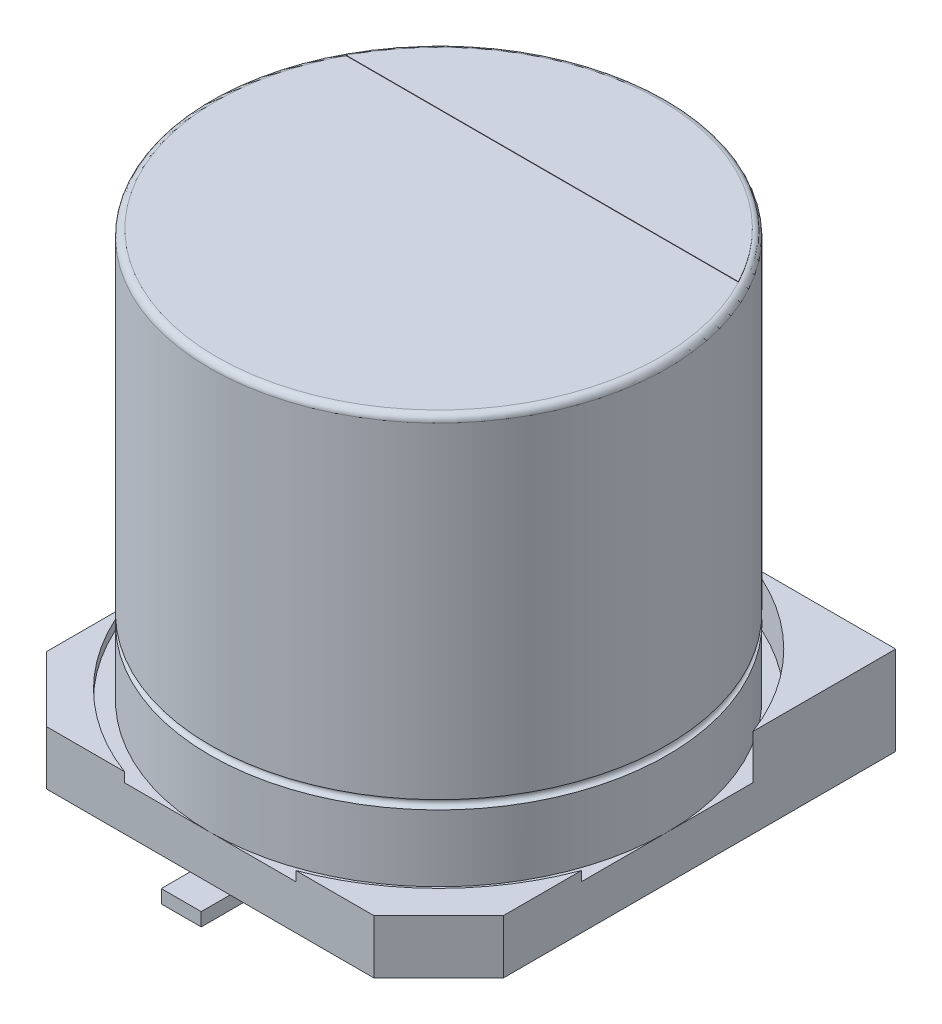
ISO-10303-21;
HEADER;
FILE_DESCRIPTION(('STEP AP214'),'2;1');
FILE_NAME('part.step','',(''),(''),'','','');
FILE_SCHEMA(('AUTOMOTIVE_DESIGN { 1 0 10303 214 1 1 1 1 }'));
ENDSEC;
DATA;
#1=APPLICATION_CONTEXT('core data for automotive mechanical design processes');
#2=APPLICATION_PROTOCOL_DEFINITION('international standard','automotive_design',2000,#1);
#3=PRODUCT_CONTEXT('',#1,'mechanical');
#4=PRODUCT('Part','Part','',(#3));
#5=PRODUCT_RELATED_PRODUCT_CATEGORY('part','',(#4));
#6=PRODUCT_DEFINITION_FORMATION('','',#4);
#7=PRODUCT_DEFINITION_CONTEXT('part definition',#1,'design');
#8=PRODUCT_DEFINITION('design','',#6,#7);
#9=PRODUCT_DEFINITION_SHAPE('','',#8);
#10=(LENGTH_UNIT() NAMED_UNIT(*) SI_UNIT(.MILLI.,.METRE.));
#11=(NAMED_UNIT(*) PLANE_ANGLE_UNIT() SI_UNIT($,.RADIAN.));
#12=(NAMED_UNIT(*) SI_UNIT($,.STERADIAN.) SOLID_ANGLE_UNIT());
#13=UNCERTAINTY_MEASURE_WITH_UNIT(LENGTH_MEASURE(1.E-05),#10,'distance_accuracy_value','');
#14=(GEOMETRIC_REPRESENTATION_CONTEXT(3) GLOBAL_UNCERTAINTY_ASSIGNED_CONTEXT((#13)) GLOBAL_UNIT_ASSIGNED_CONTEXT((#10,
#11,#12)) REPRESENTATION_CONTEXT('',''));
#15=CARTESIAN_POINT('',(0.,0.,0.));
#16=DIRECTION('',(0.,0.,1.));
#17=DIRECTION('',(1.,0.,0.));
#18=AXIS2_PLACEMENT_3D('',#15,#16,#17);
#19=CARTESIAN_POINT('',(0.,0.,0.));
#20=DIRECTION('',(0.,-1.,0.));
#21=DIRECTION('',(0.,0.,-1.));
#22=AXIS2_PLACEMENT_3D('',#19,#20,#21);
#23=PLANE('',#22);
#24=DIRECTION('',(-1.,0.,0.));
#25=VECTOR('',#24,1.);
#26=CARTESIAN_POINT('',(0.45,0.,-2.3));
#27=LINE('',#26,#25);
#28=CARTESIAN_POINT('',(0.45,0.,-2.3));
#29=VERTEX_POINT('',#28);
#30=CARTESIAN_POINT('',(-0.45,0.,-2.3));
#31=VERTEX_POINT('',#30);
#32=EDGE_CURVE('E760',#29,#31,#27,.T.);
#33=ORIENTED_EDGE('',*,*,#32,.F.);
#34=DIRECTION('',(0.,0.,-1.));
#35=VECTOR('',#34,1.);
#36=CARTESIAN_POINT('',(0.45,0.,0.));
#37=LINE('',#36,#35);
#38=CARTESIAN_POINT('',(0.450000000000001,0.,-5.15));
#39=VERTEX_POINT('',#38);
#40=EDGE_CURVE('E11',#29,#39,#37,.T.);
#41=ORIENTED_EDGE('',*,*,#40,.T.);
#42=DIRECTION('',(-1.,0.,0.));
#43=VECTOR('',#42,1.);
#44=CARTESIAN_POINT('',(-5.15,0.,-5.15));
#45=LINE('',#44,#43);
#46=CARTESIAN_POINT('',(5.15,0.,-5.15));
#47=VERTEX_POINT('',#46);
#48=EDGE_CURVE('E422',#47,#39,#45,.T.);
#49=ORIENTED_EDGE('',*,*,#48,.F.);
#50=DIRECTION('',(0.,0.,-1.));
#51=VECTOR('',#50,1.);
#52=CARTESIAN_POINT('',(5.15,0.,-5.15));
#53=LINE('',#52,#51);
#54=CARTESIAN_POINT('',(5.15,0.,3.69119369495388));
#55=VERTEX_POINT('',#54);
#56=EDGE_CURVE('E448',#55,#47,#53,.T.);
#57=ORIENTED_EDGE('',*,*,#56,.F.);
#58=DIRECTION('',(0.707106781186548,0.,-0.707106781186547));
#59=VECTOR('',#58,1.);
#60=CARTESIAN_POINT('',(5.15,0.,3.69119369495388));
#61=LINE('',#60,#59);
#62=CARTESIAN_POINT('',(3.69119369495388,0.,5.15));
#63=VERTEX_POINT('',#62);
#64=EDGE_CURVE('E443',#63,#55,#61,.T.);
#65=ORIENTED_EDGE('',*,*,#64,.F.);
#66=DIRECTION('',(1.,0.,0.));
#67=VECTOR('',#66,1.);
#68=CARTESIAN_POINT('',(3.69119369495388,0.,5.15));
#69=LINE('',#68,#67);
#70=CARTESIAN_POINT('',(0.450000000000001,0.,5.15));
#71=VERTEX_POINT('',#70);
#72=EDGE_CURVE('E438',#71,#63,#69,.T.);
#73=ORIENTED_EDGE('',*,*,#72,.F.);
#74=DIRECTION('',(0.,0.,1.));
#75=VECTOR('',#74,1.);
#76=CARTESIAN_POINT('',(0.45,0.,2.3));
#77=LINE('',#76,#75);
#78=CARTESIAN_POINT('',(0.45,0.,2.3));
#79=VERTEX_POINT('',#78);
#80=EDGE_CURVE('E280',#79,#71,#77,.T.);
#81=ORIENTED_EDGE('',*,*,#80,.F.);
#82=DIRECTION('',(1.,0.,0.));
#83=VECTOR('',#82,1.);
#84=CARTESIAN_POINT('',(0.45,0.,2.3));
#85=LINE('',#84,#83);
#86=CARTESIAN_POINT('',(-0.45,0.,2.3));
#87=VERTEX_POINT('',#86);
#88=EDGE_CURVE('E65',#87,#79,#85,.T.);
#89=ORIENTED_EDGE('',*,*,#88,.F.);
#90=DIRECTION('',(0.,0.,-1.));
#91=VECTOR('',#90,1.);
#92=CARTESIAN_POINT('',(-0.45,0.,2.3));
#93=LINE('',#92,#91);
#94=CARTESIAN_POINT('',(-0.449999999999998,0.,5.15));
#95=VERTEX_POINT('',#94);
#96=EDGE_CURVE('E50',#95,#87,#93,.T.);
#97=ORIENTED_EDGE('',*,*,#96,.F.);
#98=CARTESIAN_POINT('',(-3.69119369495388,0.,5.15));
#99=VERTEX_POINT('',#98);
#100=EDGE_CURVE('E439',#99,#95,#69,.T.);
#101=ORIENTED_EDGE('',*,*,#100,.F.);
#102=DIRECTION('',(0.707106781186548,0.,0.707106781186547));
#103=VECTOR('',#102,1.);
#104=CARTESIAN_POINT('',(-3.69119369495388,0.,5.15));
#105=LINE('',#104,#103);
#106=CARTESIAN_POINT('',(-5.15,0.,3.69119369495388));
#107=VERTEX_POINT('',#106);
#108=EDGE_CURVE('E434',#107,#99,#105,.T.);
#109=ORIENTED_EDGE('',*,*,#108,.F.);
#110=DIRECTION('',(0.,0.,1.));
#111=VECTOR('',#110,1.);
#112=CARTESIAN_POINT('',(-5.15,0.,3.69119369495388));
#113=LINE('',#112,#111);
#114=CARTESIAN_POINT('',(-5.15,0.,-5.15));
#115=VERTEX_POINT('',#114);
#116=EDGE_CURVE('E416',#115,#107,#113,.T.);
#117=ORIENTED_EDGE('',*,*,#116,.F.);
#118=CARTESIAN_POINT('',(-0.449999999999999,0.,-5.15));
#119=VERTEX_POINT('',#118);
#120=EDGE_CURVE('E451',#119,#115,#45,.T.);
#121=ORIENTED_EDGE('',*,*,#120,.F.);
#122=DIRECTION('',(0.,0.,-1.));
#123=VECTOR('',#122,1.);
#124=CARTESIAN_POINT('',(-0.45,0.,-2.3));
#125=LINE('',#124,#123);
#126=EDGE_CURVE('E754',#31,#119,#125,.T.);
#127=ORIENTED_EDGE('',*,*,#126,.F.);
#128=EDGE_LOOP('',(#33,#41,#49,#57,#65,#73,#81,#89,#97,#101,#109,#117,#121,#127));
#129=FACE_BOUND('',#128,.T.);
#130=ADVANCED_FACE('F41',(#129),#23,.T.);
#131=CARTESIAN_POINT('',(-5.,10.2,0.));
#132=DIRECTION('',(0.,1.,0.));
#133=DIRECTION('',(0.,0.,1.));
#134=AXIS2_PLACEMENT_3D('',#131,#132,#133);
#135=PLANE('',#134);
#136=CARTESIAN_POINT('',(0.,10.2,0.));
#137=DIRECTION('',(0.,1.,0.));
#138=DIRECTION('',(0.,0.,1.));
#139=AXIS2_PLACEMENT_3D('',#136,#137,#138);
#140=CIRCLE('',#139,5.);
#141=CARTESIAN_POINT('',(-4.42028767087711,10.2,-2.33689043532038));
#142=VERTEX_POINT('',#141);
#143=CARTESIAN_POINT('',(4.42028767087711,10.2,-2.33689043532038));
#144=VERTEX_POINT('',#143);
#145=EDGE_CURVE('E336',#142,#144,#140,.T.);
#146=ORIENTED_EDGE('',*,*,#145,.T.);
#147=DIRECTION('',(1.,0.,0.));
#148=VECTOR('',#147,1.);
#149=CARTESIAN_POINT('',(-4.42028767087711,10.2,-2.33689043532038));
#150=LINE('',#149,#148);
#151=EDGE_CURVE('E301',#142,#144,#150,.T.);
#152=ORIENTED_EDGE('',*,*,#151,.F.);
#153=EDGE_LOOP('',(#146,#152));
#154=FACE_BOUND('',#153,.T.);
#155=ADVANCED_FACE('F620',(#154),#135,.T.);
#156=CARTESIAN_POINT('',(0.,1.,0.));
#157=DIRECTION('',(0.,1.,0.));
#158=DIRECTION('',(0.,0.,1.));
#159=AXIS2_PLACEMENT_3D('',#156,#157,#158);
#160=PLANE('',#159);
#161=CARTESIAN_POINT('',(0.,1.,0.));
#162=DIRECTION('',(0.,1.,0.));
#163=DIRECTION('',(0.,0.,1.));
#164=AXIS2_PLACEMENT_3D('',#161,#162,#163);
#165=CIRCLE('',#164,5.15);
#166=CARTESIAN_POINT('',(0.,1.,5.15));
#167=VERTEX_POINT('',#166);
#168=CARTESIAN_POINT('',(5.15,1.,0.));
#169=VERTEX_POINT('',#168);
#170=EDGE_CURVE('E320',#167,#169,#165,.T.);
#171=ORIENTED_EDGE('',*,*,#170,.F.);
#172=DIRECTION('',(1.,0.,0.));
#173=VECTOR('',#172,1.);
#174=CARTESIAN_POINT('',(3.69119369495388,1.,5.15));
#175=LINE('',#174,#173);
#176=CARTESIAN_POINT('',(1.93067345763078,1.,5.15));
#177=VERTEX_POINT('',#176);
#178=EDGE_CURVE('E407',#167,#177,#175,.T.);
#179=ORIENTED_EDGE('',*,*,#178,.T.);
#180=CARTESIAN_POINT('',(0.,1.,0.));
#181=DIRECTION('',(0.,1.,0.));
#182=DIRECTION('',(0.,0.,1.));
#183=AXIS2_PLACEMENT_3D('',#180,#181,#182);
#184=CIRCLE('',#183,5.5);
#185=CARTESIAN_POINT('',(5.15,1.,1.93067345763078));
#186=VERTEX_POINT('',#185);
#187=EDGE_CURVE('E365',#177,#186,#184,.T.);
#188=ORIENTED_EDGE('',*,*,#187,.T.);
#189=DIRECTION('',(0.,0.,-1.));
#190=VECTOR('',#189,1.);
#191=CARTESIAN_POINT('',(5.15,1.,-5.15));
#192=LINE('',#191,#190);
#193=EDGE_CURVE('E403',#186,#169,#192,.T.);
#194=ORIENTED_EDGE('',*,*,#193,.T.);
#195=EDGE_LOOP('',(#171,#179,#188,#194));
#196=FACE_BOUND('',#195,.T.);
#197=ADVANCED_FACE('F575',(#196),#160,.T.);
#198=CARTESIAN_POINT('',(0.,1.,0.));
#199=DIRECTION('',(0.,1.,0.));
#200=DIRECTION('',(0.,0.,1.));
#201=AXIS2_PLACEMENT_3D('',#198,#199,#200);
#202=CIRCLE('',#201,5.15);
#203=CARTESIAN_POINT('',(0.,1.,-5.15));
#204=VERTEX_POINT('',#203);
#205=EDGE_CURVE('E493',#169,#204,#202,.T.);
#206=ORIENTED_EDGE('',*,*,#205,.F.);
#207=CARTESIAN_POINT('',(5.15,1.,-1.93067345763078));
#208=VERTEX_POINT('',#207);
#209=EDGE_CURVE('E402',#169,#208,#192,.T.);
#210=ORIENTED_EDGE('',*,*,#209,.T.);
#211=CARTESIAN_POINT('',(1.93067345763078,1.,-5.15));
#212=VERTEX_POINT('',#211);
#213=EDGE_CURVE('E370',#208,#212,#184,.T.);
#214=ORIENTED_EDGE('',*,*,#213,.T.);
#215=DIRECTION('',(-1.,0.,0.));
#216=VECTOR('',#215,1.);
#217=CARTESIAN_POINT('',(-5.15,1.,-5.15));
#218=LINE('',#217,#216);
#219=EDGE_CURVE('E481',#212,#204,#218,.T.);
#220=ORIENTED_EDGE('',*,*,#219,.T.);
#221=EDGE_LOOP('',(#206,#210,#214,#220));
#222=FACE_BOUND('',#221,.T.);
#223=ADVANCED_FACE('F792',(#222),#160,.T.);
#224=CARTESIAN_POINT('',(-5.15,1.,0.));
#225=VERTEX_POINT('',#224);
#226=EDGE_CURVE('E492',#204,#225,#202,.T.);
#227=ORIENTED_EDGE('',*,*,#226,.F.);
#228=CARTESIAN_POINT('',(-1.93067345763078,1.,-5.15));
#229=VERTEX_POINT('',#228);
#230=EDGE_CURVE('E486',#204,#229,#218,.T.);
#231=ORIENTED_EDGE('',*,*,#230,.T.);
#232=CARTESIAN_POINT('',(-5.15,1.,-1.93067345763078));
#233=VERTEX_POINT('',#232);
#234=EDGE_CURVE('E553',#229,#233,#184,.T.);
#235=ORIENTED_EDGE('',*,*,#234,.T.);
#236=DIRECTION('',(0.,0.,1.));
#237=VECTOR('',#236,1.);
#238=CARTESIAN_POINT('',(-5.15,1.,3.69119369495388));
#239=LINE('',#238,#237);
#240=EDGE_CURVE('E412',#233,#225,#239,.T.);
#241=ORIENTED_EDGE('',*,*,#240,.T.);
#242=EDGE_LOOP('',(#227,#231,#235,#241));
#243=FACE_BOUND('',#242,.T.);
#244=ADVANCED_FACE('F783',(#243),#160,.T.);
#245=CARTESIAN_POINT('',(0.,2.,0.));
#246=DIRECTION('',(0.,-1.,0.));
#247=DIRECTION('',(0.,0.,-1.));
#248=AXIS2_PLACEMENT_3D('',#245,#246,#247);
#249=PLANE('',#248);
#250=DIRECTION('',(-1.,0.,0.));
#251=VECTOR('',#250,1.);
#252=CARTESIAN_POINT('',(-5.15,2.,-5.15));
#253=LINE('',#252,#251);
#254=CARTESIAN_POINT('',(5.15,2.,-5.15));
#255=VERTEX_POINT('',#254);
#256=CARTESIAN_POINT('',(1.93067345763078,2.,-5.15));
#257=VERTEX_POINT('',#256);
#258=EDGE_CURVE('E426',#255,#257,#253,.T.);
#259=ORIENTED_EDGE('',*,*,#258,.T.);
#260=CARTESIAN_POINT('',(0.,2.,0.));
#261=DIRECTION('',(0.,-1.,0.));
#262=DIRECTION('',(0.,0.,-1.));
#263=AXIS2_PLACEMENT_3D('',#260,#261,#262);
#264=CIRCLE('',#263,5.5);
#265=CARTESIAN_POINT('',(5.15,2.,-1.93067345763078));
#266=VERTEX_POINT('',#265);
#267=EDGE_CURVE('E480',#257,#266,#264,.T.);
#268=ORIENTED_EDGE('',*,*,#267,.T.);
#269=DIRECTION('',(0.,0.,-1.));
#270=VECTOR('',#269,1.);
#271=CARTESIAN_POINT('',(5.15,2.,-5.15));
#272=LINE('',#271,#270);
#273=EDGE_CURVE('E421',#266,#255,#272,.T.);
#274=ORIENTED_EDGE('',*,*,#273,.T.);
#275=EDGE_LOOP('',(#259,#268,#274));
#276=FACE_BOUND('',#275,.T.);
#277=ADVANCED_FACE('F544',(#276),#249,.F.);
#278=CARTESIAN_POINT('',(-5.15,2.,3.69119369495388));
#279=DIRECTION('',(1.,0.,0.));
#280=DIRECTION('',(0.,0.,-1.));
#281=AXIS2_PLACEMENT_3D('',#278,#279,#280);
#282=PLANE('',#281);
#283=DIRECTION('',(0.,-1.,0.));
#284=VECTOR('',#283,1.);
#285=CARTESIAN_POINT('',(-5.15,2.,3.69119369495388));
#286=LINE('',#285,#284);
#287=CARTESIAN_POINT('',(-5.15,1.21736242578591,3.69119369495388));
#288=VERTEX_POINT('',#287);
#289=EDGE_CURVE('E473',#288,#107,#286,.T.);
#290=ORIENTED_EDGE('',*,*,#289,.F.);
#291=DIRECTION('',(0.,0.,1.));
#292=VECTOR('',#291,1.);
#293=CARTESIAN_POINT('',(-5.15,1.21736242578591,0.916515138991169));
#294=LINE('',#293,#292);
#295=CARTESIAN_POINT('',(-5.15,1.21736242578591,1.93067345763078));
#296=VERTEX_POINT('',#295);
#297=EDGE_CURVE('E341',#296,#288,#294,.T.);
#298=ORIENTED_EDGE('',*,*,#297,.F.);
#299=DIRECTION('',(0.,1.,0.));
#300=VECTOR('',#299,1.);
#301=CARTESIAN_POINT('',(-5.15,1.,1.93067345763078));
#302=LINE('',#301,#300);
#303=CARTESIAN_POINT('',(-5.15,1.,1.93067345763078));
#304=VERTEX_POINT('',#303);
#305=EDGE_CURVE('E394',#296,#304,#302,.F.);
#306=ORIENTED_EDGE('',*,*,#305,.T.);
#307=EDGE_CURVE('E411',#225,#304,#239,.T.);
#308=ORIENTED_EDGE('',*,*,#307,.F.);
#309=ORIENTED_EDGE('',*,*,#240,.F.);
#310=DIRECTION('',(0.,1.,0.));
#311=VECTOR('',#310,1.);
#312=CARTESIAN_POINT('',(-5.15,1.,-1.93067345763078));
#313=LINE('',#312,#311);
#314=CARTESIAN_POINT('',(-5.15,2.,-1.93067345763078));
#315=VERTEX_POINT('',#314);
#316=EDGE_CURVE('E398',#233,#315,#313,.T.);
#317=ORIENTED_EDGE('',*,*,#316,.T.);
#318=DIRECTION('',(0.,0.,1.));
#319=VECTOR('',#318,1.);
#320=CARTESIAN_POINT('',(-5.15,2.,3.69119369495388));
#321=LINE('',#320,#319);
#322=CARTESIAN_POINT('',(-5.15,2.,-5.15));
#323=VERTEX_POINT('',#322);
#324=EDGE_CURVE('E417',#323,#315,#321,.T.);
#325=ORIENTED_EDGE('',*,*,#324,.F.);
#326=DIRECTION('',(0.,-1.,0.));
#327=VECTOR('',#326,1.);
#328=CARTESIAN_POINT('',(-5.15,2.,-5.15));
#329=LINE('',#328,#327);
#330=EDGE_CURVE('E430',#323,#115,#329,.T.);
#331=ORIENTED_EDGE('',*,*,#330,.T.);
#332=ORIENTED_EDGE('',*,*,#116,.T.);
#333=EDGE_LOOP('',(#290,#298,#306,#308,#309,#317,#325,#331,#332));
#334=FACE_BOUND('',#333,.T.);
#335=ADVANCED_FACE('F43',(#334),#282,.F.);
#336=CARTESIAN_POINT('',(-3.69119369495388,2.,5.15));
#337=DIRECTION('',(0.707106781186547,0.,-0.707106781186548));
#338=DIRECTION('',(-0.707106781186548,0.,-0.707106781186547));
#339=AXIS2_PLACEMENT_3D('',#336,#337,#338);
#340=PLANE('',#339);
#341=DIRECTION('',(0.,-1.,0.));
#342=VECTOR('',#341,1.);
#343=CARTESIAN_POINT('',(-3.69119369495388,2.,5.15));
#344=LINE('',#343,#342);
#345=CARTESIAN_POINT('',(-3.69119369495388,1.21736242578591,5.15));
#346=VERTEX_POINT('',#345);
#347=EDGE_CURVE('E470',#346,#99,#344,.T.);
#348=ORIENTED_EDGE('',*,*,#347,.F.);
#349=DIRECTION('',(-0.707106781186548,0.,-0.707106781186547));
#350=VECTOR('',#349,1.);
#351=CARTESIAN_POINT('',(-3.69119369495388,1.21736242578591,5.15));
#352=LINE('',#351,#350);
#353=EDGE_CURVE('E360',#346,#288,#352,.T.);
#354=ORIENTED_EDGE('',*,*,#353,.T.);
#355=ORIENTED_EDGE('',*,*,#289,.T.);
#356=ORIENTED_EDGE('',*,*,#108,.T.);
#357=EDGE_LOOP('',(#348,#354,#355,#356));
#358=FACE_BOUND('',#357,.T.);
#359=ADVANCED_FACE('F637',(#358),#340,.F.);
#360=CARTESIAN_POINT('',(3.69119369495388,2.,5.15));
#361=DIRECTION('',(0.,0.,-1.));
#362=DIRECTION('',(-1.,0.,0.));
#363=AXIS2_PLACEMENT_3D('',#360,#361,#362);
#364=PLANE('',#363);
#365=DIRECTION('',(0.,-1.,0.));
#366=VECTOR('',#365,1.);
#367=CARTESIAN_POINT('',(3.69119369495388,2.,5.15));
#368=LINE('',#367,#366);
#369=CARTESIAN_POINT('',(3.69119369495388,1.21736242578591,5.15));
#370=VERTEX_POINT('',#369);
#371=EDGE_CURVE('E466',#370,#63,#368,.T.);
#372=ORIENTED_EDGE('',*,*,#371,.F.);
#373=DIRECTION('',(-1.,0.,0.));
#374=VECTOR('',#373,1.);
#375=CARTESIAN_POINT('',(3.69119369495388,1.21736242578591,5.15));
#376=LINE('',#375,#374);
#377=CARTESIAN_POINT('',(1.93067345763078,1.21736242578591,5.15));
#378=VERTEX_POINT('',#377);
#379=EDGE_CURVE('E347',#370,#378,#376,.T.);
#380=ORIENTED_EDGE('',*,*,#379,.T.);
#381=DIRECTION('',(0.,1.,0.));
#382=VECTOR('',#381,1.);
#383=CARTESIAN_POINT('',(1.93067345763078,1.,5.15));
#384=LINE('',#383,#382);
#385=EDGE_CURVE('E386',#378,#177,#384,.F.);
#386=ORIENTED_EDGE('',*,*,#385,.T.);
#387=ORIENTED_EDGE('',*,*,#178,.F.);
#388=CARTESIAN_POINT('',(-1.93067345763078,1.,5.15));
#389=VERTEX_POINT('',#388);
#390=EDGE_CURVE('E408',#389,#167,#175,.T.);
#391=ORIENTED_EDGE('',*,*,#390,.F.);
#392=DIRECTION('',(0.,1.,0.));
#393=VECTOR('',#392,1.);
#394=CARTESIAN_POINT('',(-1.93067345763078,1.,5.15));
#395=LINE('',#394,#393);
#396=CARTESIAN_POINT('',(-1.93067345763078,1.21736242578591,5.15));
#397=VERTEX_POINT('',#396);
#398=EDGE_CURVE('E390',#389,#397,#395,.T.);
#399=ORIENTED_EDGE('',*,*,#398,.T.);
#400=EDGE_CURVE('E352',#397,#346,#376,.T.);
#401=ORIENTED_EDGE('',*,*,#400,.T.);
#402=ORIENTED_EDGE('',*,*,#347,.T.);
#403=ORIENTED_EDGE('',*,*,#100,.T.);
#404=EDGE_CURVE('E444',#95,#71,#69,.T.);
#405=ORIENTED_EDGE('',*,*,#404,.T.);
#406=ORIENTED_EDGE('',*,*,#72,.T.);
#407=EDGE_LOOP('',(#372,#380,#386,#387,#391,#399,#401,#402,#403,#405,#406));
#408=FACE_BOUND('',#407,.T.);
#409=ADVANCED_FACE('F525',(#408),#364,.F.);
#410=CARTESIAN_POINT('',(5.15,2.,3.69119369495388));
#411=DIRECTION('',(-0.707106781186547,0.,-0.707106781186548));
#412=DIRECTION('',(-0.707106781186548,0.,0.707106781186547));
#413=AXIS2_PLACEMENT_3D('',#410,#411,#412);
#414=PLANE('',#413);
#415=DIRECTION('',(0.,-1.,0.));
#416=VECTOR('',#415,1.);
#417=CARTESIAN_POINT('',(5.15,2.,3.69119369495388));
#418=LINE('',#417,#416);
#419=CARTESIAN_POINT('',(5.15,1.21736242578591,3.69119369495388));
#420=VERTEX_POINT('',#419);
#421=EDGE_CURVE('E463',#420,#55,#418,.T.);
#422=ORIENTED_EDGE('',*,*,#421,.F.);
#423=DIRECTION('',(-0.707106781186548,0.,0.707106781186547));
#424=VECTOR('',#423,1.);
#425=CARTESIAN_POINT('',(5.15,1.21736242578591,3.69119369495388));
#426=LINE('',#425,#424);
#427=EDGE_CURVE('E351',#420,#370,#426,.T.);
#428=ORIENTED_EDGE('',*,*,#427,.T.);
#429=ORIENTED_EDGE('',*,*,#371,.T.);
#430=ORIENTED_EDGE('',*,*,#64,.T.);
#431=EDGE_LOOP('',(#422,#428,#429,#430));
#432=FACE_BOUND('',#431,.T.);
#433=ADVANCED_FACE('F529',(#432),#414,.F.);
#434=CARTESIAN_POINT('',(5.15,2.,-5.15));
#435=DIRECTION('',(-1.,0.,0.));
#436=DIRECTION('',(0.,0.,1.));
#437=AXIS2_PLACEMENT_3D('',#434,#435,#436);
#438=PLANE('',#437);
#439=DIRECTION('',(0.,1.,0.));
#440=VECTOR('',#439,1.);
#441=CARTESIAN_POINT('',(5.15,1.,1.93067345763078));
#442=LINE('',#441,#440);
#443=CARTESIAN_POINT('',(5.15,1.21736242578591,1.93067345763078));
#444=VERTEX_POINT('',#443);
#445=EDGE_CURVE('E382',#186,#444,#442,.T.);
#446=ORIENTED_EDGE('',*,*,#445,.T.);
#447=DIRECTION('',(0.,0.,-1.));
#448=VECTOR('',#447,1.);
#449=CARTESIAN_POINT('',(5.15,1.21736242578591,0.916515138991169));
#450=LINE('',#449,#448);
#451=EDGE_CURVE('E344',#420,#444,#450,.T.);
#452=ORIENTED_EDGE('',*,*,#451,.F.);
#453=ORIENTED_EDGE('',*,*,#421,.T.);
#454=ORIENTED_EDGE('',*,*,#56,.T.);
#455=DIRECTION('',(0.,-1.,0.));
#456=VECTOR('',#455,1.);
#457=CARTESIAN_POINT('',(5.15,2.,-5.15));
#458=LINE('',#457,#456);
#459=EDGE_CURVE('E459',#255,#47,#458,.T.);
#460=ORIENTED_EDGE('',*,*,#459,.F.);
#461=ORIENTED_EDGE('',*,*,#273,.F.);
#462=DIRECTION('',(0.,1.,0.));
#463=VECTOR('',#462,1.);
#464=CARTESIAN_POINT('',(5.15,1.,-1.93067345763078));
#465=LINE('',#464,#463);
#466=EDGE_CURVE('E378',#266,#208,#465,.F.);
#467=ORIENTED_EDGE('',*,*,#466,.T.);
#468=ORIENTED_EDGE('',*,*,#209,.F.);
#469=ORIENTED_EDGE('',*,*,#193,.F.);
#470=EDGE_LOOP('',(#446,#452,#453,#454,#460,#461,#467,#468,#469));
#471=FACE_BOUND('',#470,.T.);
#472=ADVANCED_FACE('F534',(#471),#438,.F.);
#473=CARTESIAN_POINT('',(-5.15,2.,-5.15));
#474=DIRECTION('',(0.,0.,1.));
#475=DIRECTION('',(1.,0.,0.));
#476=AXIS2_PLACEMENT_3D('',#473,#474,#475);
#477=PLANE('',#476);
#478=ORIENTED_EDGE('',*,*,#219,.F.);
#479=DIRECTION('',(0.,1.,0.));
#480=VECTOR('',#479,1.);
#481=CARTESIAN_POINT('',(1.93067345763078,1.,-5.15));
#482=LINE('',#481,#480);
#483=EDGE_CURVE('E374',#212,#257,#482,.T.);
#484=ORIENTED_EDGE('',*,*,#483,.T.);
#485=ORIENTED_EDGE('',*,*,#258,.F.);
#486=ORIENTED_EDGE('',*,*,#459,.T.);
#487=ORIENTED_EDGE('',*,*,#48,.T.);
#488=EDGE_CURVE('E455',#39,#119,#45,.T.);
#489=ORIENTED_EDGE('',*,*,#488,.T.);
#490=ORIENTED_EDGE('',*,*,#120,.T.);
#491=ORIENTED_EDGE('',*,*,#330,.F.);
#492=CARTESIAN_POINT('',(-1.93067345763078,2.,-5.15));
#493=VERTEX_POINT('',#492);
#494=EDGE_CURVE('E425',#493,#323,#253,.T.);
#495=ORIENTED_EDGE('',*,*,#494,.F.);
#496=DIRECTION('',(0.,1.,0.));
#497=VECTOR('',#496,1.);
#498=CARTESIAN_POINT('',(-1.93067345763078,1.,-5.15));
#499=LINE('',#498,#497);
#500=EDGE_CURVE('E369',#493,#229,#499,.F.);
#501=ORIENTED_EDGE('',*,*,#500,.T.);
#502=ORIENTED_EDGE('',*,*,#230,.F.);
#503=EDGE_LOOP('',(#478,#484,#485,#486,#487,#489,#490,#491,#495,#501,#502));
#504=FACE_BOUND('',#503,.T.);
#505=ADVANCED_FACE('F540',(#504),#477,.F.);
#506=ORIENTED_EDGE('',*,*,#324,.T.);
#507=EDGE_CURVE('E476',#315,#493,#264,.T.);
#508=ORIENTED_EDGE('',*,*,#507,.T.);
#509=ORIENTED_EDGE('',*,*,#494,.T.);
#510=EDGE_LOOP('',(#506,#508,#509));
#511=FACE_BOUND('',#510,.T.);
#512=ADVANCED_FACE('F628',(#511),#249,.F.);
#513=EDGE_CURVE('E489',#225,#167,#202,.T.);
#514=ORIENTED_EDGE('',*,*,#513,.F.);
#515=ORIENTED_EDGE('',*,*,#307,.T.);
#516=EDGE_CURVE('E364',#304,#389,#184,.T.);
#517=ORIENTED_EDGE('',*,*,#516,.T.);
#518=ORIENTED_EDGE('',*,*,#390,.T.);
#519=EDGE_LOOP('',(#514,#515,#517,#518));
#520=FACE_BOUND('',#519,.T.);
#521=ADVANCED_FACE('F564',(#520),#160,.T.);
#522=CARTESIAN_POINT('',(0.,1.,0.));
#523=DIRECTION('',(0.,1.,0.));
#524=DIRECTION('',(0.,0.,1.));
#525=AXIS2_PLACEMENT_3D('',#522,#523,#524);
#526=CYLINDRICAL_SURFACE('',#525,5.5);
#527=ORIENTED_EDGE('',*,*,#234,.F.);
#528=ORIENTED_EDGE('',*,*,#500,.F.);
#529=ORIENTED_EDGE('',*,*,#507,.F.);
#530=ORIENTED_EDGE('',*,*,#316,.F.);
#531=EDGE_LOOP('',(#527,#528,#529,#530));
#532=FACE_BOUND('',#531,.T.);
#533=ADVANCED_FACE('F785',(#532),#526,.F.);
#534=ORIENTED_EDGE('',*,*,#305,.F.);
#535=CARTESIAN_POINT('',(0.,1.21736242578591,0.));
#536=DIRECTION('',(0.,-1.,0.));
#537=DIRECTION('',(0.,0.,-1.));
#538=AXIS2_PLACEMENT_3D('',#535,#536,#537);
#539=CIRCLE('',#538,5.5);
#540=EDGE_CURVE('E356',#296,#397,#539,.F.);
#541=ORIENTED_EDGE('',*,*,#540,.T.);
#542=ORIENTED_EDGE('',*,*,#398,.F.);
#543=ORIENTED_EDGE('',*,*,#516,.F.);
#544=EDGE_LOOP('',(#534,#541,#542,#543));
#545=FACE_BOUND('',#544,.T.);
#546=ADVANCED_FACE('F802',(#545),#526,.F.);
#547=ORIENTED_EDGE('',*,*,#385,.F.);
#548=CARTESIAN_POINT('',(0.,1.21736242578591,0.));
#549=DIRECTION('',(0.,-1.,0.));
#550=DIRECTION('',(0.,0.,-1.));
#551=AXIS2_PLACEMENT_3D('',#548,#549,#550);
#552=CIRCLE('',#551,5.5);
#553=EDGE_CURVE('E485',#378,#444,#552,.F.);
#554=ORIENTED_EDGE('',*,*,#553,.T.);
#555=ORIENTED_EDGE('',*,*,#445,.F.);
#556=ORIENTED_EDGE('',*,*,#187,.F.);
#557=EDGE_LOOP('',(#547,#554,#555,#556));
#558=FACE_BOUND('',#557,.T.);
#559=ADVANCED_FACE('F806',(#558),#526,.F.);
#560=ORIENTED_EDGE('',*,*,#267,.F.);
#561=ORIENTED_EDGE('',*,*,#483,.F.);
#562=ORIENTED_EDGE('',*,*,#213,.F.);
#563=ORIENTED_EDGE('',*,*,#466,.F.);
#564=EDGE_LOOP('',(#560,#561,#562,#563));
#565=FACE_BOUND('',#564,.T.);
#566=ADVANCED_FACE('F549',(#565),#526,.F.);
#567=CARTESIAN_POINT('',(10.3843862563784,1.21736242578591,0.916515138991169));
#568=DIRECTION('',(0.,-1.,0.));
#569=DIRECTION('',(0.,0.,-1.));
#570=AXIS2_PLACEMENT_3D('',#567,#568,#569);
#571=PLANE('',#570);
#572=ORIENTED_EDGE('',*,*,#451,.T.);
#573=ORIENTED_EDGE('',*,*,#553,.F.);
#574=ORIENTED_EDGE('',*,*,#379,.F.);
#575=ORIENTED_EDGE('',*,*,#427,.F.);
#576=EDGE_LOOP('',(#572,#573,#574,#575));
#577=FACE_BOUND('',#576,.T.);
#578=ADVANCED_FACE('F808',(#577),#571,.F.);
#579=ORIENTED_EDGE('',*,*,#400,.F.);
#580=ORIENTED_EDGE('',*,*,#540,.F.);
#581=ORIENTED_EDGE('',*,*,#297,.T.);
#582=ORIENTED_EDGE('',*,*,#353,.F.);
#583=EDGE_LOOP('',(#579,#580,#581,#582));
#584=FACE_BOUND('',#583,.T.);
#585=ADVANCED_FACE('F598',(#584),#571,.F.);
#586=CARTESIAN_POINT('',(0.,10.05,0.));
#587=DIRECTION('',(0.,1.,0.));
#588=DIRECTION('',(0.,0.,1.));
#589=AXIS2_PLACEMENT_3D('',#586,#587,#588);
#590=TOROIDAL_SURFACE('',#589,5.,0.15);
#591=CARTESIAN_POINT('',(0.,10.05,0.));
#592=DIRECTION('',(0.,1.,0.));
#593=DIRECTION('',(0.,0.,1.));
#594=AXIS2_PLACEMENT_3D('',#591,#592,#593);
#595=CIRCLE('',#594,5.15);
#596=CARTESIAN_POINT('',(0.,10.05,5.15));
#597=VERTEX_POINT('',#596);
#598=EDGE_CURVE('E332',#597,#597,#595,.T.);
#599=ORIENTED_EDGE('',*,*,#598,.T.);
#600=EDGE_LOOP('',(#599));
#601=FACE_BOUND('',#600,.T.);
#602=EDGE_CURVE('E337',#144,#142,#140,.T.);
#603=ORIENTED_EDGE('',*,*,#602,.F.);
#604=ORIENTED_EDGE('',*,*,#145,.F.);
#605=EDGE_LOOP('',(#603,#604));
#606=FACE_BOUND('',#605,.T.);
#607=ADVANCED_FACE('F592',(#601,#606),#590,.T.);
#608=CARTESIAN_POINT('',(0.,10.2,0.));
#609=DIRECTION('',(0.,1.,0.));
#610=DIRECTION('',(0.,0.,1.));
#611=AXIS2_PLACEMENT_3D('',#608,#609,#610);
#612=CYLINDRICAL_SURFACE('',#611,5.15);
#613=CARTESIAN_POINT('',(0.,2.7,0.));
#614=DIRECTION('',(0.,1.,0.));
#615=DIRECTION('',(0.,0.,1.));
#616=AXIS2_PLACEMENT_3D('',#613,#614,#615);
#617=CIRCLE('',#616,5.15);
#618=CARTESIAN_POINT('',(0.,2.7,5.15));
#619=VERTEX_POINT('',#618);
#620=EDGE_CURVE('E328',#619,#619,#617,.T.);
#621=ORIENTED_EDGE('',*,*,#620,.T.);
#622=EDGE_LOOP('',(#621));
#623=FACE_BOUND('',#622,.T.);
#624=ORIENTED_EDGE('',*,*,#598,.F.);
#625=EDGE_LOOP('',(#624));
#626=FACE_BOUND('',#625,.T.);
#627=ADVANCED_FACE('F586',(#623,#626),#612,.T.);
#628=CARTESIAN_POINT('',(0.,2.6,0.));
#629=DIRECTION('',(0.,1.,0.));
#630=DIRECTION('',(0.,0.,1.));
#631=AXIS2_PLACEMENT_3D('',#628,#629,#630);
#632=TOROIDAL_SURFACE('',#631,5.15,0.0999999999999998);
#633=CARTESIAN_POINT('',(0.,2.5,0.));
#634=DIRECTION('',(0.,1.,0.));
#635=DIRECTION('',(0.,0.,1.));
#636=AXIS2_PLACEMENT_3D('',#633,#634,#635);
#637=CIRCLE('',#636,5.15);
#638=CARTESIAN_POINT('',(0.,2.5,5.15));
#639=VERTEX_POINT('',#638);
#640=EDGE_CURVE('E324',#639,#639,#637,.T.);
#641=ORIENTED_EDGE('',*,*,#640,.T.);
#642=EDGE_LOOP('',(#641));
#643=FACE_BOUND('',#642,.T.);
#644=ORIENTED_EDGE('',*,*,#620,.F.);
#645=EDGE_LOOP('',(#644));
#646=FACE_BOUND('',#645,.T.);
#647=ADVANCED_FACE('F580',(#643,#646),#632,.F.);
#648=CARTESIAN_POINT('',(0.,10.2,0.));
#649=DIRECTION('',(0.,1.,0.));
#650=DIRECTION('',(0.,0.,1.));
#651=AXIS2_PLACEMENT_3D('',#648,#649,#650);
#652=CYLINDRICAL_SURFACE('',#651,5.15);
#653=ORIENTED_EDGE('',*,*,#170,.T.);
#654=ORIENTED_EDGE('',*,*,#205,.T.);
#655=ORIENTED_EDGE('',*,*,#226,.T.);
#656=ORIENTED_EDGE('',*,*,#513,.T.);
#657=EDGE_LOOP('',(#653,#654,#655,#656));
#658=FACE_BOUND('',#657,.T.);
#659=ORIENTED_EDGE('',*,*,#640,.F.);
#660=EDGE_LOOP('',(#659));
#661=FACE_BOUND('',#660,.T.);
#662=ADVANCED_FACE('F576',(#658,#661),#652,.T.);
#663=CARTESIAN_POINT('',(0.,10.21,0.));
#664=DIRECTION('',(0.,-1.,0.));
#665=DIRECTION('',(0.,0.,-1.));
#666=AXIS2_PLACEMENT_3D('',#663,#664,#665);
#667=CYLINDRICAL_SURFACE('',#666,5.);
#668=ORIENTED_EDGE('',*,*,#602,.T.);
#669=DIRECTION('',(0.,-1.,0.));
#670=VECTOR('',#669,1.);
#671=CARTESIAN_POINT('',(-4.42028767087711,10.21,-2.33689043532038));
#672=LINE('',#671,#670);
#673=CARTESIAN_POINT('',(-4.42028767087711,10.21,-2.33689043532038));
#674=VERTEX_POINT('',#673);
#675=EDGE_CURVE('E316',#674,#142,#672,.T.);
#676=ORIENTED_EDGE('',*,*,#675,.F.);
#677=CARTESIAN_POINT('',(0.,10.21,0.));
#678=DIRECTION('',(0.,1.,0.));
#679=DIRECTION('',(0.,0.,1.));
#680=AXIS2_PLACEMENT_3D('',#677,#678,#679);
#681=CIRCLE('',#680,5.);
#682=CARTESIAN_POINT('',(4.42028767087711,10.21,-2.33689043532038));
#683=VERTEX_POINT('',#682);
#684=EDGE_CURVE('E302',#683,#674,#681,.T.);
#685=ORIENTED_EDGE('',*,*,#684,.F.);
#686=DIRECTION('',(0.,-1.,0.));
#687=VECTOR('',#686,1.);
#688=CARTESIAN_POINT('',(4.42028767087711,10.21,-2.33689043532038));
#689=LINE('',#688,#687);
#690=EDGE_CURVE('E309',#683,#144,#689,.T.);
#691=ORIENTED_EDGE('',*,*,#690,.T.);
#692=EDGE_LOOP('',(#668,#676,#685,#691));
#693=FACE_BOUND('',#692,.T.);
#694=ADVANCED_FACE('F579',(#693),#667,.T.);
#695=CARTESIAN_POINT('',(-4.42028767087711,10.21,-2.33689043532038));
#696=DIRECTION('',(0.,0.,-1.));
#697=DIRECTION('',(-1.,0.,0.));
#698=AXIS2_PLACEMENT_3D('',#695,#696,#697);
#699=PLANE('',#698);
#700=ORIENTED_EDGE('',*,*,#151,.T.);
#701=ORIENTED_EDGE('',*,*,#690,.F.);
#702=DIRECTION('',(1.,0.,0.));
#703=VECTOR('',#702,1.);
#704=CARTESIAN_POINT('',(-4.42028767087711,10.21,-2.33689043532038));
#705=LINE('',#704,#703);
#706=EDGE_CURVE('E306',#674,#683,#705,.T.);
#707=ORIENTED_EDGE('',*,*,#706,.F.);
#708=ORIENTED_EDGE('',*,*,#675,.T.);
#709=EDGE_LOOP('',(#700,#701,#707,#708));
#710=FACE_BOUND('',#709,.T.);
#711=ADVANCED_FACE('F606',(#710),#699,.F.);
#712=CARTESIAN_POINT('',(0.,10.21,0.));
#713=DIRECTION('',(0.,1.,0.));
#714=DIRECTION('',(0.,0.,1.));
#715=AXIS2_PLACEMENT_3D('',#712,#713,#714);
#716=PLANE('',#715);
#717=ORIENTED_EDGE('',*,*,#684,.T.);
#718=ORIENTED_EDGE('',*,*,#706,.T.);
#719=EDGE_LOOP('',(#717,#718));
#720=FACE_BOUND('',#719,.T.);
#721=ADVANCED_FACE('F610',(#720),#716,.T.);
#722=CARTESIAN_POINT('',(-0.45,-0.3,2.3));
#723=DIRECTION('',(1.,0.,0.));
#724=DIRECTION('',(0.,0.,-1.));
#725=AXIS2_PLACEMENT_3D('',#722,#723,#724);
#726=PLANE('',#725);
#727=CARTESIAN_POINT('',(-0.45,0.,5.8));
#728=VERTEX_POINT('',#727);
#729=EDGE_CURVE('E252',#728,#95,#93,.T.);
#730=ORIENTED_EDGE('',*,*,#729,.T.);
#731=ORIENTED_EDGE('',*,*,#96,.T.);
#732=DIRECTION('',(0.,1.,0.));
#733=VECTOR('',#732,1.);
#734=CARTESIAN_POINT('',(-0.45,-0.3,2.3));
#735=LINE('',#734,#733);
#736=CARTESIAN_POINT('',(-0.45,-0.3,2.3));
#737=VERTEX_POINT('',#736);
#738=EDGE_CURVE('E297',#737,#87,#735,.T.);
#739=ORIENTED_EDGE('',*,*,#738,.F.);
#740=DIRECTION('',(0.,0.,-1.));
#741=VECTOR('',#740,1.);
#742=CARTESIAN_POINT('',(-0.45,-0.3,2.3));
#743=LINE('',#742,#741);
#744=CARTESIAN_POINT('',(-0.45,-0.3,5.8));
#745=VERTEX_POINT('',#744);
#746=EDGE_CURVE('E262',#745,#737,#743,.T.);
#747=ORIENTED_EDGE('',*,*,#746,.F.);
#748=DIRECTION('',(0.,1.,0.));
#749=VECTOR('',#748,1.);
#750=CARTESIAN_POINT('',(-0.45,-0.3,5.8));
#751=LINE('',#750,#749);
#752=EDGE_CURVE('E275',#745,#728,#751,.T.);
#753=ORIENTED_EDGE('',*,*,#752,.T.);
#754=EDGE_LOOP('',(#730,#731,#739,#747,#753));
#755=FACE_BOUND('',#754,.T.);
#756=ADVANCED_FACE('F502',(#755),#726,.F.);
#757=CARTESIAN_POINT('',(0.45,-0.3,2.3));
#758=DIRECTION('',(0.,0.,1.));
#759=DIRECTION('',(1.,0.,0.));
#760=AXIS2_PLACEMENT_3D('',#757,#758,#759);
#761=PLANE('',#760);
#762=ORIENTED_EDGE('',*,*,#88,.T.);
#763=DIRECTION('',(0.,1.,0.));
#764=VECTOR('',#763,1.);
#765=CARTESIAN_POINT('',(0.45,-0.3,2.3));
#766=LINE('',#765,#764);
#767=CARTESIAN_POINT('',(0.45,-0.3,2.3));
#768=VERTEX_POINT('',#767);
#769=EDGE_CURVE('E293',#768,#79,#766,.T.);
#770=ORIENTED_EDGE('',*,*,#769,.F.);
#771=DIRECTION('',(1.,0.,0.));
#772=VECTOR('',#771,1.);
#773=CARTESIAN_POINT('',(0.45,-0.3,2.3));
#774=LINE('',#773,#772);
#775=EDGE_CURVE('E266',#737,#768,#774,.T.);
#776=ORIENTED_EDGE('',*,*,#775,.F.);
#777=ORIENTED_EDGE('',*,*,#738,.T.);
#778=EDGE_LOOP('',(#762,#770,#776,#777));
#779=FACE_BOUND('',#778,.T.);
#780=ADVANCED_FACE('F507',(#779),#761,.F.);
#781=CARTESIAN_POINT('',(0.45,-0.3,2.3));
#782=DIRECTION('',(-1.,0.,0.));
#783=DIRECTION('',(0.,0.,1.));
#784=AXIS2_PLACEMENT_3D('',#781,#782,#783);
#785=PLANE('',#784);
#786=ORIENTED_EDGE('',*,*,#80,.T.);
#787=CARTESIAN_POINT('',(0.45,0.,5.8));
#788=VERTEX_POINT('',#787);
#789=EDGE_CURVE('E279',#71,#788,#77,.T.);
#790=ORIENTED_EDGE('',*,*,#789,.T.);
#791=DIRECTION('',(0.,1.,0.));
#792=VECTOR('',#791,1.);
#793=CARTESIAN_POINT('',(0.45,-0.3,5.8));
#794=LINE('',#793,#792);
#795=CARTESIAN_POINT('',(0.45,-0.3,5.8));
#796=VERTEX_POINT('',#795);
#797=EDGE_CURVE('E289',#796,#788,#794,.T.);
#798=ORIENTED_EDGE('',*,*,#797,.F.);
#799=DIRECTION('',(0.,0.,1.));
#800=VECTOR('',#799,1.);
#801=CARTESIAN_POINT('',(0.45,-0.3,2.3));
#802=LINE('',#801,#800);
#803=EDGE_CURVE('E270',#768,#796,#802,.T.);
#804=ORIENTED_EDGE('',*,*,#803,.F.);
#805=ORIENTED_EDGE('',*,*,#769,.T.);
#806=EDGE_LOOP('',(#786,#790,#798,#804,#805));
#807=FACE_BOUND('',#806,.T.);
#808=ADVANCED_FACE('F653',(#807),#785,.F.);
#809=CARTESIAN_POINT('',(0.45,-0.3,5.8));
#810=DIRECTION('',(0.,0.,-1.));
#811=DIRECTION('',(-1.,0.,0.));
#812=AXIS2_PLACEMENT_3D('',#809,#810,#811);
#813=PLANE('',#812);
#814=DIRECTION('',(-1.,0.,0.));
#815=VECTOR('',#814,1.);
#816=CARTESIAN_POINT('',(0.45,0.,5.8));
#817=LINE('',#816,#815);
#818=EDGE_CURVE('E267',#788,#728,#817,.T.);
#819=ORIENTED_EDGE('',*,*,#818,.T.);
#820=ORIENTED_EDGE('',*,*,#752,.F.);
#821=DIRECTION('',(-1.,0.,0.));
#822=VECTOR('',#821,1.);
#823=CARTESIAN_POINT('',(0.45,-0.3,5.8));
#824=LINE('',#823,#822);
#825=EDGE_CURVE('E273',#796,#745,#824,.T.);
#826=ORIENTED_EDGE('',*,*,#825,.F.);
#827=ORIENTED_EDGE('',*,*,#797,.T.);
#828=EDGE_LOOP('',(#819,#820,#826,#827));
#829=FACE_BOUND('',#828,.T.);
#830=ADVANCED_FACE('F654',(#829),#813,.F.);
#831=CARTESIAN_POINT('',(0.,-0.3,0.));
#832=DIRECTION('',(0.,-1.,0.));
#833=DIRECTION('',(0.,0.,-1.));
#834=AXIS2_PLACEMENT_3D('',#831,#832,#833);
#835=PLANE('',#834);
#836=ORIENTED_EDGE('',*,*,#746,.T.);
#837=ORIENTED_EDGE('',*,*,#775,.T.);
#838=ORIENTED_EDGE('',*,*,#803,.T.);
#839=ORIENTED_EDGE('',*,*,#825,.T.);
#840=EDGE_LOOP('',(#836,#837,#838,#839));
#841=FACE_BOUND('',#840,.T.);
#842=ADVANCED_FACE('F511',(#841),#835,.T.);
#843=CARTESIAN_POINT('',(0.,0.,0.));
#844=DIRECTION('',(0.,-1.,0.));
#845=DIRECTION('',(0.,0.,-1.));
#846=AXIS2_PLACEMENT_3D('',#843,#844,#845);
#847=PLANE('',#846);
#848=ORIENTED_EDGE('',*,*,#404,.F.);
#849=ORIENTED_EDGE('',*,*,#729,.F.);
#850=ORIENTED_EDGE('',*,*,#818,.F.);
#851=ORIENTED_EDGE('',*,*,#789,.F.);
#852=EDGE_LOOP('',(#848,#849,#850,#851));
#853=FACE_BOUND('',#852,.T.);
#854=ADVANCED_FACE('F518',(#853),#847,.F.);
#855=CARTESIAN_POINT('',(0.,0.,0.));
#856=DIRECTION('',(0.,1.,0.));
#857=DIRECTION('',(0.,0.,1.));
#858=AXIS2_PLACEMENT_3D('',#855,#856,#857);
#859=PLANE('',#858);
#860=ORIENTED_EDGE('',*,*,#488,.F.);
#861=DIRECTION('',(0.,0.,1.));
#862=VECTOR('',#861,1.);
#863=CARTESIAN_POINT('',(0.45,0.,-2.3));
#864=LINE('',#863,#862);
#865=CARTESIAN_POINT('',(0.450000000000001,0.,-5.8));
#866=VERTEX_POINT('',#865);
#867=EDGE_CURVE('E756',#866,#39,#864,.T.);
#868=ORIENTED_EDGE('',*,*,#867,.F.);
#869=DIRECTION('',(1.,0.,0.));
#870=VECTOR('',#869,1.);
#871=CARTESIAN_POINT('',(0.450000000000001,0.,-5.8));
#872=LINE('',#871,#870);
#873=CARTESIAN_POINT('',(-0.449999999999999,0.,-5.8));
#874=VERTEX_POINT('',#873);
#875=EDGE_CURVE('E247',#874,#866,#872,.T.);
#876=ORIENTED_EDGE('',*,*,#875,.F.);
#877=EDGE_CURVE('E763',#119,#874,#125,.T.);
#878=ORIENTED_EDGE('',*,*,#877,.F.);
#879=EDGE_LOOP('',(#860,#868,#876,#878));
#880=FACE_BOUND('',#879,.T.);
#881=ADVANCED_FACE('F693',(#880),#859,.T.);
#882=CARTESIAN_POINT('',(0.45,-0.3,-2.3));
#883=DIRECTION('',(-1.,0.,0.));
#884=DIRECTION('',(0.,0.,1.));
#885=AXIS2_PLACEMENT_3D('',#882,#883,#884);
#886=PLANE('',#885);
#887=ORIENTED_EDGE('',*,*,#867,.T.);
#888=ORIENTED_EDGE('',*,*,#40,.F.);
#889=DIRECTION('',(0.,1.,0.));
#890=VECTOR('',#889,1.);
#891=CARTESIAN_POINT('',(0.45,-0.3,-2.3));
#892=LINE('',#891,#890);
#893=CARTESIAN_POINT('',(0.45,-0.3,-2.3));
#894=VERTEX_POINT('',#893);
#895=EDGE_CURVE('E232',#894,#29,#892,.T.);
#896=ORIENTED_EDGE('',*,*,#895,.F.);
#897=DIRECTION('',(0.,0.,1.));
#898=VECTOR('',#897,1.);
#899=CARTESIAN_POINT('',(0.45,-0.3,-2.3));
#900=LINE('',#899,#898);
#901=CARTESIAN_POINT('',(0.450000000000001,-0.3,-5.8));
#902=VERTEX_POINT('',#901);
#903=EDGE_CURVE('E237',#902,#894,#900,.T.);
#904=ORIENTED_EDGE('',*,*,#903,.F.);
#905=DIRECTION('',(0.,1.,0.));
#906=VECTOR('',#905,1.);
#907=CARTESIAN_POINT('',(0.450000000000001,-0.3,-5.8));
#908=LINE('',#907,#906);
#909=EDGE_CURVE('E750',#902,#866,#908,.T.);
#910=ORIENTED_EDGE('',*,*,#909,.T.);
#911=EDGE_LOOP('',(#887,#888,#896,#904,#910));
#912=FACE_BOUND('',#911,.T.);
#913=ADVANCED_FACE('F250',(#912),#886,.F.);
#914=CARTESIAN_POINT('',(0.45,-0.3,-2.3));
#915=DIRECTION('',(0.,0.,-1.));
#916=DIRECTION('',(-1.,0.,0.));
#917=AXIS2_PLACEMENT_3D('',#914,#915,#916);
#918=PLANE('',#917);
#919=ORIENTED_EDGE('',*,*,#32,.T.);
#920=DIRECTION('',(0.,1.,0.));
#921=VECTOR('',#920,1.);
#922=CARTESIAN_POINT('',(-0.45,-0.3,-2.3));
#923=LINE('',#922,#921);
#924=CARTESIAN_POINT('',(-0.45,-0.3,-2.3));
#925=VERTEX_POINT('',#924);
#926=EDGE_CURVE('E57',#925,#31,#923,.T.);
#927=ORIENTED_EDGE('',*,*,#926,.F.);
#928=DIRECTION('',(-1.,0.,0.));
#929=VECTOR('',#928,1.);
#930=CARTESIAN_POINT('',(0.45,-0.3,-2.3));
#931=LINE('',#930,#929);
#932=EDGE_CURVE('E228',#894,#925,#931,.T.);
#933=ORIENTED_EDGE('',*,*,#932,.F.);
#934=ORIENTED_EDGE('',*,*,#895,.T.);
#935=EDGE_LOOP('',(#919,#927,#933,#934));
#936=FACE_BOUND('',#935,.T.);
#937=ADVANCED_FACE('F230',(#936),#918,.F.);
#938=CARTESIAN_POINT('',(-0.45,-0.3,-2.3));
#939=DIRECTION('',(1.,0.,0.));
#940=DIRECTION('',(0.,0.,-1.));
#941=AXIS2_PLACEMENT_3D('',#938,#939,#940);
#942=PLANE('',#941);
#943=ORIENTED_EDGE('',*,*,#126,.T.);
#944=ORIENTED_EDGE('',*,*,#877,.T.);
#945=DIRECTION('',(0.,1.,0.));
#946=VECTOR('',#945,1.);
#947=CARTESIAN_POINT('',(-0.449999999999999,-0.3,-5.8));
#948=LINE('',#947,#946);
#949=CARTESIAN_POINT('',(-0.449999999999999,-0.3,-5.8));
#950=VERTEX_POINT('',#949);
#951=EDGE_CURVE('E258',#950,#874,#948,.T.);
#952=ORIENTED_EDGE('',*,*,#951,.F.);
#953=DIRECTION('',(0.,0.,-1.));
#954=VECTOR('',#953,1.);
#955=CARTESIAN_POINT('',(-0.45,-0.3,-2.3));
#956=LINE('',#955,#954);
#957=EDGE_CURVE('E236',#925,#950,#956,.T.);
#958=ORIENTED_EDGE('',*,*,#957,.F.);
#959=ORIENTED_EDGE('',*,*,#926,.T.);
#960=EDGE_LOOP('',(#943,#944,#952,#958,#959));
#961=FACE_BOUND('',#960,.T.);
#962=ADVANCED_FACE('F718',(#961),#942,.F.);
#963=CARTESIAN_POINT('',(0.450000000000001,-0.3,-5.8));
#964=DIRECTION('',(0.,0.,1.));
#965=DIRECTION('',(1.,0.,0.));
#966=AXIS2_PLACEMENT_3D('',#963,#964,#965);
#967=PLANE('',#966);
#968=ORIENTED_EDGE('',*,*,#875,.T.);
#969=ORIENTED_EDGE('',*,*,#909,.F.);
#970=DIRECTION('',(1.,0.,0.));
#971=VECTOR('',#970,1.);
#972=CARTESIAN_POINT('',(0.450000000000001,-0.3,-5.8));
#973=LINE('',#972,#971);
#974=EDGE_CURVE('E242',#950,#902,#973,.T.);
#975=ORIENTED_EDGE('',*,*,#974,.F.);
#976=ORIENTED_EDGE('',*,*,#951,.T.);
#977=EDGE_LOOP('',(#968,#969,#975,#976));
#978=FACE_BOUND('',#977,.T.);
#979=ADVANCED_FACE('F727',(#978),#967,.F.);
#980=CARTESIAN_POINT('',(0.,-0.3,0.));
#981=DIRECTION('',(0.,1.,0.));
#982=DIRECTION('',(0.,0.,1.));
#983=AXIS2_PLACEMENT_3D('',#980,#981,#982);
#984=PLANE('',#983);
#985=ORIENTED_EDGE('',*,*,#903,.T.);
#986=ORIENTED_EDGE('',*,*,#932,.T.);
#987=ORIENTED_EDGE('',*,*,#957,.T.);
#988=ORIENTED_EDGE('',*,*,#974,.T.);
#989=EDGE_LOOP('',(#985,#986,#987,#988));
#990=FACE_BOUND('',#989,.T.);
#991=ADVANCED_FACE('F240',(#990),#984,.F.);
#992=CLOSED_SHELL('',(#130,#155,#197,#223,#244,#277,#335,#359,#409,#433,#472,#505,#512,#521,
#533,#546,#559,#566,#578,#585,#607,#627,#647,#662,#694,#711,#721,#756,#780,#808,#830,#842,#854,
#881,#913,#937,#962,#979,#991));
#993=MANIFOLD_SOLID_BREP('B2',#992);
#994=ADVANCED_BREP_SHAPE_REPRESENTATION('',(#18,#993),#14);
#995=SHAPE_DEFINITION_REPRESENTATION(#9,#994);
ENDSEC;
END-ISO-10303-21;
